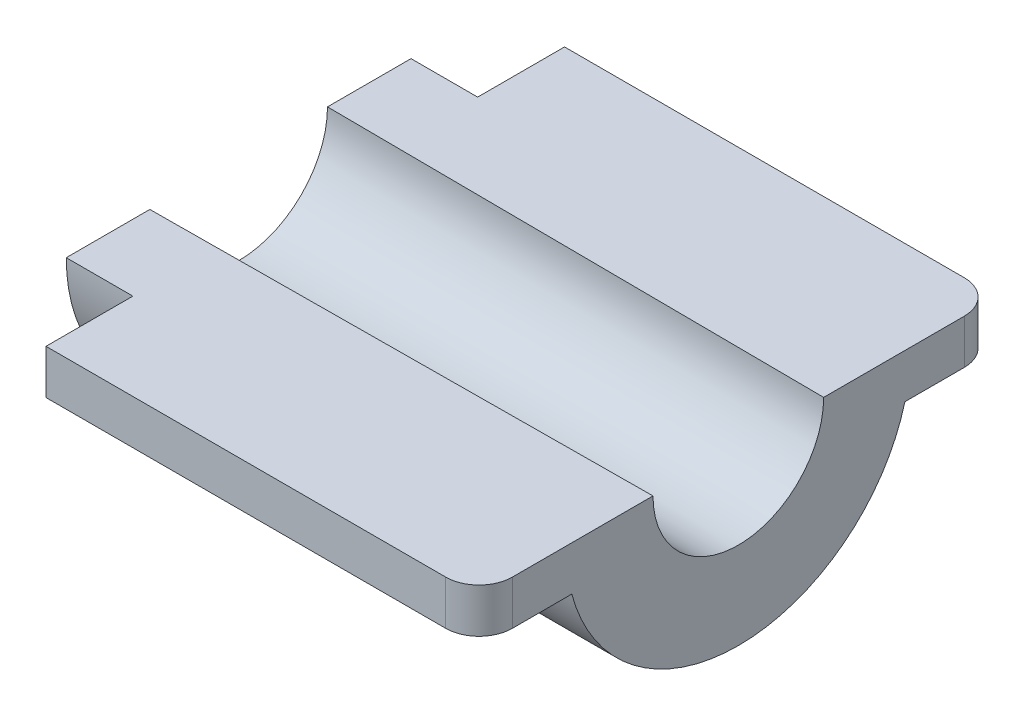
ISO-10303-21;
HEADER;
FILE_DESCRIPTION(('STEP AP214'),'2;1');
FILE_NAME('part.step','',(''),(''),'','','');
FILE_SCHEMA(('AUTOMOTIVE_DESIGN { 1 0 10303 214 1 1 1 1 }'));
ENDSEC;
DATA;
#1=APPLICATION_CONTEXT('core data for automotive mechanical design processes');
#2=APPLICATION_PROTOCOL_DEFINITION('international standard','automotive_design',2000,#1);
#3=PRODUCT_CONTEXT('',#1,'mechanical');
#4=PRODUCT('Part','Part','',(#3));
#5=PRODUCT_RELATED_PRODUCT_CATEGORY('part','',(#4));
#6=PRODUCT_DEFINITION_FORMATION('','',#4);
#7=PRODUCT_DEFINITION_CONTEXT('part definition',#1,'design');
#8=PRODUCT_DEFINITION('design','',#6,#7);
#9=PRODUCT_DEFINITION_SHAPE('','',#8);
#10=(LENGTH_UNIT() NAMED_UNIT(*) SI_UNIT(.MILLI.,.METRE.));
#11=(NAMED_UNIT(*) PLANE_ANGLE_UNIT() SI_UNIT($,.RADIAN.));
#12=(NAMED_UNIT(*) SI_UNIT($,.STERADIAN.) SOLID_ANGLE_UNIT());
#13=UNCERTAINTY_MEASURE_WITH_UNIT(LENGTH_MEASURE(1.E-05),#10,'distance_accuracy_value','');
#14=(GEOMETRIC_REPRESENTATION_CONTEXT(3) GLOBAL_UNCERTAINTY_ASSIGNED_CONTEXT((#13)) GLOBAL_UNIT_ASSIGNED_CONTEXT((#10,
#11,#12)) REPRESENTATION_CONTEXT('',''));
#15=CARTESIAN_POINT('',(0.,0.,0.));
#16=DIRECTION('',(0.,0.,1.));
#17=DIRECTION('',(1.,0.,0.));
#18=AXIS2_PLACEMENT_3D('',#15,#16,#17);
#19=CARTESIAN_POINT('',(35.,0.,0.));
#20=DIRECTION('',(0.,1.,0.));
#21=DIRECTION('',(0.,0.,1.));
#22=AXIS2_PLACEMENT_3D('',#19,#20,#21);
#23=PLANE('',#22);
#24=DIRECTION('',(-0.999975630705395,0.,-0.00698126029796157));
#25=VECTOR('',#24,1.);
#26=CARTESIAN_POINT('',(1135.8969733558,0.,0.));
#27=LINE('',#26,#25);
#28=CARTESIAN_POINT('',(35.,0.,-7.68583563062766));
#29=VERTEX_POINT('',#28);
#30=CARTESIAN_POINT('',(-10.,0.,-8.));
#31=VERTEX_POINT('',#30);
#32=EDGE_CURVE('E51',#29,#31,#27,.T.);
#33=ORIENTED_EDGE('',*,*,#32,.F.);
#34=DIRECTION('',(0.,0.,-1.));
#35=VECTOR('',#34,1.);
#36=CARTESIAN_POINT('',(35.,0.,0.));
#37=LINE('',#36,#35);
#38=CARTESIAN_POINT('',(35.,0.,-20.35));
#39=VERTEX_POINT('',#38);
#40=EDGE_CURVE('E139',#29,#39,#37,.T.);
#41=ORIENTED_EDGE('',*,*,#40,.T.);
#42=CARTESIAN_POINT('',(32.,0.,-20.35));
#43=DIRECTION('',(0.,1.,0.));
#44=DIRECTION('',(0.,0.,1.));
#45=AXIS2_PLACEMENT_3D('',#42,#43,#44);
#46=CIRCLE('',#45,3.);
#47=CARTESIAN_POINT('',(32.,0.,-23.35));
#48=VERTEX_POINT('',#47);
#49=EDGE_CURVE('E174',#39,#48,#46,.T.);
#50=ORIENTED_EDGE('',*,*,#49,.T.);
#51=DIRECTION('',(-1.,0.,0.));
#52=VECTOR('',#51,1.);
#53=CARTESIAN_POINT('',(35.,0.,-23.35));
#54=LINE('',#53,#52);
#55=CARTESIAN_POINT('',(-4.,0.,-23.35));
#56=VERTEX_POINT('',#55);
#57=EDGE_CURVE('E154',#48,#56,#54,.T.);
#58=ORIENTED_EDGE('',*,*,#57,.T.);
#59=DIRECTION('',(0.,0.,-1.));
#60=VECTOR('',#59,1.);
#61=CARTESIAN_POINT('',(-4.,0.,-15.52417469626));
#62=LINE('',#61,#60);
#63=CARTESIAN_POINT('',(-4.,0.,-15.52417469626));
#64=VERTEX_POINT('',#63);
#65=EDGE_CURVE('E208',#64,#56,#62,.T.);
#66=ORIENTED_EDGE('',*,*,#65,.F.);
#67=DIRECTION('',(1.,0.,0.));
#68=VECTOR('',#67,1.);
#69=CARTESIAN_POINT('',(-10.,0.,-15.52417469626));
#70=LINE('',#69,#68);
#71=CARTESIAN_POINT('',(-10.,0.,-15.52417469626));
#72=VERTEX_POINT('',#71);
#73=EDGE_CURVE('E190',#72,#64,#70,.T.);
#74=ORIENTED_EDGE('',*,*,#73,.F.);
#75=DIRECTION('',(0.,0.,-1.));
#76=VECTOR('',#75,1.);
#77=CARTESIAN_POINT('',(-10.,0.,0.));
#78=LINE('',#77,#76);
#79=EDGE_CURVE('E201',#31,#72,#78,.T.);
#80=ORIENTED_EDGE('',*,*,#79,.F.);
#81=EDGE_LOOP('',(#33,#41,#50,#58,#66,#74,#80));
#82=FACE_BOUND('',#81,.T.);
#83=ADVANCED_FACE('F37',(#82),#23,.T.);
#84=CARTESIAN_POINT('',(35.,0.,0.));
#85=DIRECTION('',(-1.,0.,0.));
#86=DIRECTION('',(0.,0.,1.));
#87=AXIS2_PLACEMENT_3D('',#84,#85,#86);
#88=CYLINDRICAL_SURFACE('',#87,15.52417469626);
#89=DIRECTION('',(-1.,0.,0.));
#90=VECTOR('',#89,1.);
#91=CARTESIAN_POINT('',(35.,-4.,15.));
#92=LINE('',#91,#90);
#93=CARTESIAN_POINT('',(35.,-4.,15.));
#94=VERTEX_POINT('',#93);
#95=CARTESIAN_POINT('',(-4.,-4.,15.));
#96=VERTEX_POINT('',#95);
#97=EDGE_CURVE('E59',#94,#96,#92,.T.);
#98=ORIENTED_EDGE('',*,*,#97,.T.);
#99=CARTESIAN_POINT('',(-4.,0.,0.));
#100=DIRECTION('',(1.,0.,0.));
#101=DIRECTION('',(0.,0.,-1.));
#102=AXIS2_PLACEMENT_3D('',#99,#100,#101);
#103=CIRCLE('',#102,15.52417469626);
#104=CARTESIAN_POINT('',(-4.,0.,15.52417469626));
#105=VERTEX_POINT('',#104);
#106=EDGE_CURVE('E223',#105,#96,#103,.T.);
#107=ORIENTED_EDGE('',*,*,#106,.F.);
#108=DIRECTION('',(1.,0.,0.));
#109=VECTOR('',#108,1.);
#110=CARTESIAN_POINT('',(-10.,0.,15.52417469626));
#111=LINE('',#110,#109);
#112=CARTESIAN_POINT('',(-10.,0.,15.52417469626));
#113=VERTEX_POINT('',#112);
#114=EDGE_CURVE('E194',#113,#105,#111,.T.);
#115=ORIENTED_EDGE('',*,*,#114,.F.);
#116=CARTESIAN_POINT('',(-10.,0.,0.));
#117=DIRECTION('',(-1.,0.,0.));
#118=DIRECTION('',(0.,0.,1.));
#119=AXIS2_PLACEMENT_3D('',#116,#117,#118);
#120=CIRCLE('',#119,15.52417469626);
#121=EDGE_CURVE('E197',#72,#113,#120,.T.);
#122=ORIENTED_EDGE('',*,*,#121,.F.);
#123=ORIENTED_EDGE('',*,*,#73,.T.);
#124=CARTESIAN_POINT('',(-4.,0.,0.));
#125=DIRECTION('',(1.,0.,0.));
#126=DIRECTION('',(0.,0.,1.));
#127=AXIS2_PLACEMENT_3D('',#124,#125,#126);
#128=CIRCLE('',#127,15.52417469626);
#129=CARTESIAN_POINT('',(-4.,-4.,-15.));
#130=VERTEX_POINT('',#129);
#131=EDGE_CURVE('E211',#130,#64,#128,.T.);
#132=ORIENTED_EDGE('',*,*,#131,.F.);
#133=DIRECTION('',(-1.,0.,0.));
#134=VECTOR('',#133,1.);
#135=CARTESIAN_POINT('',(35.,-4.,-15.));
#136=LINE('',#135,#134);
#137=CARTESIAN_POINT('',(35.,-4.,-15.));
#138=VERTEX_POINT('',#137);
#139=EDGE_CURVE('E158',#138,#130,#136,.T.);
#140=ORIENTED_EDGE('',*,*,#139,.F.);
#141=CARTESIAN_POINT('',(35.,0.,0.));
#142=DIRECTION('',(1.,0.,0.));
#143=DIRECTION('',(0.,0.,-1.));
#144=AXIS2_PLACEMENT_3D('',#141,#142,#143);
#145=CIRCLE('',#144,15.52417469626);
#146=EDGE_CURVE('E186',#94,#138,#145,.T.);
#147=ORIENTED_EDGE('',*,*,#146,.F.);
#148=EDGE_LOOP('',(#98,#107,#115,#122,#123,#132,#140,#147));
#149=FACE_BOUND('',#148,.T.);
#150=ADVANCED_FACE('F231',(#149),#88,.T.);
#151=CARTESIAN_POINT('',(32.,0.,-20.35));
#152=DIRECTION('',(0.,-1.,0.));
#153=DIRECTION('',(0.,0.,-1.));
#154=AXIS2_PLACEMENT_3D('',#151,#152,#153);
#155=CYLINDRICAL_SURFACE('',#154,3.);
#156=DIRECTION('',(0.,-1.,0.));
#157=VECTOR('',#156,1.);
#158=CARTESIAN_POINT('',(32.,0.,-23.35));
#159=LINE('',#158,#157);
#160=CARTESIAN_POINT('',(32.,-4.,-23.35));
#161=VERTEX_POINT('',#160);
#162=EDGE_CURVE('E169',#48,#161,#159,.T.);
#163=ORIENTED_EDGE('',*,*,#162,.F.);
#164=ORIENTED_EDGE('',*,*,#49,.F.);
#165=DIRECTION('',(0.,-1.,0.));
#166=VECTOR('',#165,1.);
#167=CARTESIAN_POINT('',(35.,0.,-20.35));
#168=LINE('',#167,#166);
#169=CARTESIAN_POINT('',(35.,-4.,-20.35));
#170=VERTEX_POINT('',#169);
#171=EDGE_CURVE('E172',#170,#39,#168,.F.);
#172=ORIENTED_EDGE('',*,*,#171,.F.);
#173=CARTESIAN_POINT('',(32.,-4.,-20.35));
#174=DIRECTION('',(0.,1.,0.));
#175=DIRECTION('',(0.,0.,1.));
#176=AXIS2_PLACEMENT_3D('',#173,#174,#175);
#177=CIRCLE('',#176,3.);
#178=EDGE_CURVE('E45',#161,#170,#177,.F.);
#179=ORIENTED_EDGE('',*,*,#178,.F.);
#180=EDGE_LOOP('',(#163,#164,#172,#179));
#181=FACE_BOUND('',#180,.T.);
#182=ADVANCED_FACE('F39',(#181),#155,.T.);
#183=CARTESIAN_POINT('',(32.,0.,20.35));
#184=DIRECTION('',(0.,1.,0.));
#185=DIRECTION('',(0.,0.,1.));
#186=AXIS2_PLACEMENT_3D('',#183,#184,#185);
#187=CYLINDRICAL_SURFACE('',#186,3.);
#188=DIRECTION('',(0.,-1.,0.));
#189=VECTOR('',#188,1.);
#190=CARTESIAN_POINT('',(35.,0.,20.35));
#191=LINE('',#190,#189);
#192=CARTESIAN_POINT('',(35.,0.,20.35));
#193=VERTEX_POINT('',#192);
#194=CARTESIAN_POINT('',(35.,-4.,20.35));
#195=VERTEX_POINT('',#194);
#196=EDGE_CURVE('E161',#193,#195,#191,.T.);
#197=ORIENTED_EDGE('',*,*,#196,.F.);
#198=CARTESIAN_POINT('',(32.,0.,20.35));
#199=DIRECTION('',(0.,1.,0.));
#200=DIRECTION('',(0.,0.,1.));
#201=AXIS2_PLACEMENT_3D('',#198,#199,#200);
#202=CIRCLE('',#201,3.);
#203=CARTESIAN_POINT('',(32.,0.,23.35));
#204=VERTEX_POINT('',#203);
#205=EDGE_CURVE('E143',#204,#193,#202,.T.);
#206=ORIENTED_EDGE('',*,*,#205,.F.);
#207=DIRECTION('',(0.,-1.,0.));
#208=VECTOR('',#207,1.);
#209=CARTESIAN_POINT('',(32.,0.,23.35));
#210=LINE('',#209,#208);
#211=CARTESIAN_POINT('',(32.,-4.,23.35));
#212=VERTEX_POINT('',#211);
#213=EDGE_CURVE('E163',#212,#204,#210,.F.);
#214=ORIENTED_EDGE('',*,*,#213,.F.);
#215=CARTESIAN_POINT('',(32.,-4.,20.35));
#216=DIRECTION('',(0.,-1.,0.));
#217=DIRECTION('',(0.,0.,-1.));
#218=AXIS2_PLACEMENT_3D('',#215,#216,#217);
#219=CIRCLE('',#218,3.);
#220=EDGE_CURVE('E167',#195,#212,#219,.T.);
#221=ORIENTED_EDGE('',*,*,#220,.F.);
#222=EDGE_LOOP('',(#197,#206,#214,#221));
#223=FACE_BOUND('',#222,.T.);
#224=ADVANCED_FACE('F251',(#223),#187,.T.);
#225=CARTESIAN_POINT('',(35.,-4.,0.));
#226=DIRECTION('',(0.,-1.,0.));
#227=DIRECTION('',(0.,0.,-1.));
#228=AXIS2_PLACEMENT_3D('',#225,#226,#227);
#229=PLANE('',#228);
#230=DIRECTION('',(0.,0.,1.));
#231=VECTOR('',#230,1.);
#232=CARTESIAN_POINT('',(35.,-4.,0.));
#233=LINE('',#232,#231);
#234=EDGE_CURVE('E188',#94,#195,#233,.T.);
#235=ORIENTED_EDGE('',*,*,#234,.T.);
#236=ORIENTED_EDGE('',*,*,#220,.T.);
#237=DIRECTION('',(-1.,0.,0.));
#238=VECTOR('',#237,1.);
#239=CARTESIAN_POINT('',(35.,-4.,23.35));
#240=LINE('',#239,#238);
#241=CARTESIAN_POINT('',(-4.,-3.99999999999999,23.35));
#242=VERTEX_POINT('',#241);
#243=EDGE_CURVE('E145',#212,#242,#240,.T.);
#244=ORIENTED_EDGE('',*,*,#243,.T.);
#245=DIRECTION('',(0.,0.,1.));
#246=VECTOR('',#245,1.);
#247=CARTESIAN_POINT('',(-4.,-3.99999999999999,23.35));
#248=LINE('',#247,#246);
#249=EDGE_CURVE('E220',#96,#242,#248,.T.);
#250=ORIENTED_EDGE('',*,*,#249,.F.);
#251=ORIENTED_EDGE('',*,*,#97,.F.);
#252=EDGE_LOOP('',(#235,#236,#244,#250,#251));
#253=FACE_BOUND('',#252,.T.);
#254=ADVANCED_FACE('F245',(#253),#229,.T.);
#255=CARTESIAN_POINT('',(35.,-4.,0.));
#256=DIRECTION('',(0.,1.,0.));
#257=DIRECTION('',(0.,0.,1.));
#258=AXIS2_PLACEMENT_3D('',#255,#256,#257);
#259=PLANE('',#258);
#260=DIRECTION('',(-1.,0.,0.));
#261=VECTOR('',#260,1.);
#262=CARTESIAN_POINT('',(35.,-4.,-23.35));
#263=LINE('',#262,#261);
#264=CARTESIAN_POINT('',(-4.,-4.,-23.35));
#265=VERTEX_POINT('',#264);
#266=EDGE_CURVE('E156',#161,#265,#263,.T.);
#267=ORIENTED_EDGE('',*,*,#266,.F.);
#268=ORIENTED_EDGE('',*,*,#178,.T.);
#269=DIRECTION('',(0.,0.,-1.));
#270=VECTOR('',#269,1.);
#271=CARTESIAN_POINT('',(35.,-4.,0.));
#272=LINE('',#271,#270);
#273=EDGE_CURVE('E149',#138,#170,#272,.T.);
#274=ORIENTED_EDGE('',*,*,#273,.F.);
#275=ORIENTED_EDGE('',*,*,#139,.T.);
#276=DIRECTION('',(0.,0.,1.));
#277=VECTOR('',#276,1.);
#278=CARTESIAN_POINT('',(-4.,-4.,-23.35));
#279=LINE('',#278,#277);
#280=EDGE_CURVE('E202',#265,#130,#279,.T.);
#281=ORIENTED_EDGE('',*,*,#280,.F.);
#282=EDGE_LOOP('',(#267,#268,#274,#275,#281));
#283=FACE_BOUND('',#282,.T.);
#284=ADVANCED_FACE('F179',(#283),#259,.F.);
#285=CARTESIAN_POINT('',(35.,0.,-23.35));
#286=DIRECTION('',(0.,0.,-1.));
#287=DIRECTION('',(-1.,0.,0.));
#288=AXIS2_PLACEMENT_3D('',#285,#286,#287);
#289=PLANE('',#288);
#290=ORIENTED_EDGE('',*,*,#57,.F.);
#291=ORIENTED_EDGE('',*,*,#162,.T.);
#292=ORIENTED_EDGE('',*,*,#266,.T.);
#293=DIRECTION('',(0.,-1.,0.));
#294=VECTOR('',#293,1.);
#295=CARTESIAN_POINT('',(-4.,0.,-23.35));
#296=LINE('',#295,#294);
#297=EDGE_CURVE('E205',#56,#265,#296,.T.);
#298=ORIENTED_EDGE('',*,*,#297,.F.);
#299=EDGE_LOOP('',(#290,#291,#292,#298));
#300=FACE_BOUND('',#299,.T.);
#301=ADVANCED_FACE('F267',(#300),#289,.T.);
#302=DIRECTION('',(0.999975630705395,0.,-0.00698126029796157));
#303=VECTOR('',#302,1.);
#304=CARTESIAN_POINT('',(1135.8969733558,0.,0.));
#305=LINE('',#304,#303);
#306=CARTESIAN_POINT('',(-10.,0.,8.));
#307=VERTEX_POINT('',#306);
#308=CARTESIAN_POINT('',(35.,0.,7.68583563062766));
#309=VERTEX_POINT('',#308);
#310=EDGE_CURVE('E123',#307,#309,#305,.T.);
#311=ORIENTED_EDGE('',*,*,#310,.F.);
#312=EDGE_CURVE('E199',#113,#307,#78,.T.);
#313=ORIENTED_EDGE('',*,*,#312,.F.);
#314=ORIENTED_EDGE('',*,*,#114,.T.);
#315=DIRECTION('',(0.,0.,-1.));
#316=VECTOR('',#315,1.);
#317=CARTESIAN_POINT('',(-4.,0.,15.52417469626));
#318=LINE('',#317,#316);
#319=CARTESIAN_POINT('',(-4.,0.,23.35));
#320=VERTEX_POINT('',#319);
#321=EDGE_CURVE('E214',#320,#105,#318,.T.);
#322=ORIENTED_EDGE('',*,*,#321,.F.);
#323=DIRECTION('',(-1.,0.,0.));
#324=VECTOR('',#323,1.);
#325=CARTESIAN_POINT('',(35.,0.,23.35));
#326=LINE('',#325,#324);
#327=EDGE_CURVE('E147',#204,#320,#326,.T.);
#328=ORIENTED_EDGE('',*,*,#327,.F.);
#329=ORIENTED_EDGE('',*,*,#205,.T.);
#330=EDGE_CURVE('E137',#193,#309,#37,.T.);
#331=ORIENTED_EDGE('',*,*,#330,.T.);
#332=EDGE_LOOP('',(#311,#313,#314,#322,#328,#329,#331));
#333=FACE_BOUND('',#332,.T.);
#334=ADVANCED_FACE('F141',(#333),#23,.T.);
#335=CARTESIAN_POINT('',(35.,0.,23.35));
#336=DIRECTION('',(0.,0.,-1.));
#337=DIRECTION('',(-1.,0.,0.));
#338=AXIS2_PLACEMENT_3D('',#335,#336,#337);
#339=PLANE('',#338);
#340=ORIENTED_EDGE('',*,*,#243,.F.);
#341=ORIENTED_EDGE('',*,*,#213,.T.);
#342=ORIENTED_EDGE('',*,*,#327,.T.);
#343=DIRECTION('',(0.,1.,0.));
#344=VECTOR('',#343,1.);
#345=CARTESIAN_POINT('',(-4.,0.,23.35));
#346=LINE('',#345,#344);
#347=EDGE_CURVE('E217',#242,#320,#346,.T.);
#348=ORIENTED_EDGE('',*,*,#347,.F.);
#349=EDGE_LOOP('',(#340,#341,#342,#348));
#350=FACE_BOUND('',#349,.T.);
#351=ADVANCED_FACE('F249',(#350),#339,.F.);
#352=CARTESIAN_POINT('',(35.,0.,0.));
#353=DIRECTION('',(1.,0.,0.));
#354=DIRECTION('',(0.,0.,-1.));
#355=AXIS2_PLACEMENT_3D('',#352,#353,#354);
#356=PLANE('',#355);
#357=CARTESIAN_POINT('',(35.,0.,0.));
#358=DIRECTION('',(-1.,0.,0.));
#359=DIRECTION('',(0.,0.,1.));
#360=AXIS2_PLACEMENT_3D('',#357,#358,#359);
#361=CIRCLE('',#360,7.68583563062766);
#362=EDGE_CURVE('E126',#29,#309,#361,.T.);
#363=ORIENTED_EDGE('',*,*,#362,.T.);
#364=ORIENTED_EDGE('',*,*,#330,.F.);
#365=ORIENTED_EDGE('',*,*,#196,.T.);
#366=ORIENTED_EDGE('',*,*,#234,.F.);
#367=ORIENTED_EDGE('',*,*,#146,.T.);
#368=ORIENTED_EDGE('',*,*,#273,.T.);
#369=ORIENTED_EDGE('',*,*,#171,.T.);
#370=ORIENTED_EDGE('',*,*,#40,.F.);
#371=EDGE_LOOP('',(#363,#364,#365,#366,#367,#368,#369,#370));
#372=FACE_BOUND('',#371,.T.);
#373=ADVANCED_FACE('F135',(#372),#356,.T.);
#374=CARTESIAN_POINT('',(-10.,0.,0.));
#375=DIRECTION('',(-1.,0.,0.));
#376=DIRECTION('',(0.,0.,1.));
#377=AXIS2_PLACEMENT_3D('',#374,#375,#376);
#378=PLANE('',#377);
#379=CARTESIAN_POINT('',(-10.,0.,0.));
#380=DIRECTION('',(-1.,0.,0.));
#381=DIRECTION('',(0.,0.,1.));
#382=AXIS2_PLACEMENT_3D('',#379,#380,#381);
#383=CIRCLE('',#382,8.);
#384=EDGE_CURVE('E11',#31,#307,#383,.T.);
#385=ORIENTED_EDGE('',*,*,#384,.F.);
#386=ORIENTED_EDGE('',*,*,#79,.T.);
#387=ORIENTED_EDGE('',*,*,#121,.T.);
#388=ORIENTED_EDGE('',*,*,#312,.T.);
#389=EDGE_LOOP('',(#385,#386,#387,#388));
#390=FACE_BOUND('',#389,.T.);
#391=ADVANCED_FACE('F234',(#390),#378,.T.);
#392=CARTESIAN_POINT('',(-4.,0.,0.));
#393=DIRECTION('',(-1.,0.,0.));
#394=DIRECTION('',(0.,0.,1.));
#395=AXIS2_PLACEMENT_3D('',#392,#393,#394);
#396=PLANE('',#395);
#397=ORIENTED_EDGE('',*,*,#131,.T.);
#398=ORIENTED_EDGE('',*,*,#65,.T.);
#399=ORIENTED_EDGE('',*,*,#297,.T.);
#400=ORIENTED_EDGE('',*,*,#280,.T.);
#401=EDGE_LOOP('',(#397,#398,#399,#400));
#402=FACE_BOUND('',#401,.T.);
#403=ADVANCED_FACE('F243',(#402),#396,.T.);
#404=CARTESIAN_POINT('',(-4.,0.,0.));
#405=DIRECTION('',(1.,0.,0.));
#406=DIRECTION('',(0.,0.,-1.));
#407=AXIS2_PLACEMENT_3D('',#404,#405,#406);
#408=PLANE('',#407);
#409=ORIENTED_EDGE('',*,*,#106,.T.);
#410=ORIENTED_EDGE('',*,*,#249,.T.);
#411=ORIENTED_EDGE('',*,*,#347,.T.);
#412=ORIENTED_EDGE('',*,*,#321,.T.);
#413=EDGE_LOOP('',(#409,#410,#411,#412));
#414=FACE_BOUND('',#413,.T.);
#415=ADVANCED_FACE('F227',(#414),#408,.F.);
#416=CARTESIAN_POINT('',(-10.,0.,0.));
#417=DIRECTION('',(-1.,0.,0.));
#418=DIRECTION('',(0.,0.,1.));
#419=AXIS2_PLACEMENT_3D('',#416,#417,#418);
#420=CONICAL_SURFACE('',#419,8.,0.00698131700797733);
#421=ORIENTED_EDGE('',*,*,#32,.T.);
#422=ORIENTED_EDGE('',*,*,#384,.T.);
#423=ORIENTED_EDGE('',*,*,#310,.T.);
#424=ORIENTED_EDGE('',*,*,#362,.F.);
#425=EDGE_LOOP('',(#421,#422,#423,#424));
#426=FACE_BOUND('',#425,.T.);
#427=ADVANCED_FACE('F125',(#426),#420,.F.);
#428=CLOSED_SHELL('',(#83,#150,#182,#224,#254,#284,#301,#334,#351,#373,#391,#403,#415,#427));
#429=MANIFOLD_SOLID_BREP('B2',#428);
#430=ADVANCED_BREP_SHAPE_REPRESENTATION('',(#18,#429),#14);
#431=SHAPE_DEFINITION_REPRESENTATION(#9,#430);
ENDSEC;
END-ISO-10303-21;
